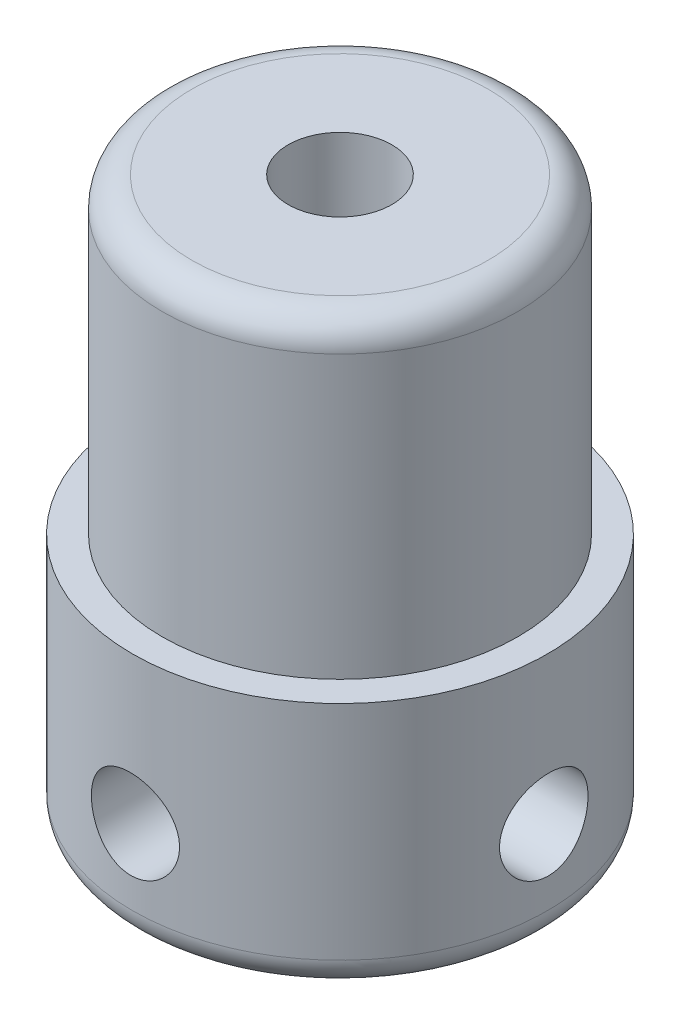
ISO-10303-21;
HEADER;
FILE_DESCRIPTION(('STEP AP214'),'2;1');
FILE_NAME('part.step','',(''),(''),'','','');
FILE_SCHEMA(('AUTOMOTIVE_DESIGN { 1 0 10303 214 1 1 1 1 }'));
ENDSEC;
DATA;
#1=APPLICATION_CONTEXT('core data for automotive mechanical design processes');
#2=APPLICATION_PROTOCOL_DEFINITION('international standard','automotive_design',2000,#1);
#3=PRODUCT_CONTEXT('',#1,'mechanical');
#4=PRODUCT('Part','Part','',(#3));
#5=PRODUCT_RELATED_PRODUCT_CATEGORY('part','',(#4));
#6=PRODUCT_DEFINITION_FORMATION('','',#4);
#7=PRODUCT_DEFINITION_CONTEXT('part definition',#1,'design');
#8=PRODUCT_DEFINITION('design','',#6,#7);
#9=PRODUCT_DEFINITION_SHAPE('','',#8);
#10=(LENGTH_UNIT() NAMED_UNIT(*) SI_UNIT(.MILLI.,.METRE.));
#11=(NAMED_UNIT(*) PLANE_ANGLE_UNIT() SI_UNIT($,.RADIAN.));
#12=(NAMED_UNIT(*) SI_UNIT($,.STERADIAN.) SOLID_ANGLE_UNIT());
#13=UNCERTAINTY_MEASURE_WITH_UNIT(LENGTH_MEASURE(1.E-05),#10,'distance_accuracy_value','');
#14=(GEOMETRIC_REPRESENTATION_CONTEXT(3) GLOBAL_UNCERTAINTY_ASSIGNED_CONTEXT((#13)) GLOBAL_UNIT_ASSIGNED_CONTEXT((#10,
#11,#12)) REPRESENTATION_CONTEXT('',''));
#15=CARTESIAN_POINT('',(0.,0.,0.));
#16=DIRECTION('',(0.,0.,1.));
#17=DIRECTION('',(1.,0.,0.));
#18=AXIS2_PLACEMENT_3D('',#15,#16,#17);
#19=CARTESIAN_POINT('',(-14.3123668381804,8.5,-6.40728050313883));
#20=DIRECTION('',(0.,-1.,0.));
#21=DIRECTION('',(0.,0.,-1.));
#22=AXIS2_PLACEMENT_3D('',#19,#20,#21);
#23=CYLINDRICAL_SURFACE('',#22,7.);
#24=CARTESIAN_POINT('',(-7.48286172927359,3.5,-7.94281297346152));
#25=CARTESIAN_POINT('',(-7.48286003159209,3.41684905906204,-7.94281004962418));
#26=CARTESIAN_POINT('',(-7.48129048481099,3.33366266436916,-7.93587524798542));
#27=CARTESIAN_POINT('',(-7.47519024919394,3.16965431702362,-7.90834935228958));
#28=CARTESIAN_POINT('',(-7.47065736078958,3.08883416733196,-7.88774811402277));
#29=CARTESIAN_POINT('',(-7.45915884845227,2.93195634842496,-7.83356977599854));
#30=CARTESIAN_POINT('',(-7.45219591234133,2.85589352639696,-7.80000700834909));
#31=CARTESIAN_POINT('',(-7.43661090340418,2.71047847104764,-7.72090084952481));
#32=CARTESIAN_POINT('',(-7.42798887334753,2.64112606480872,-7.67535776717768));
#33=CARTESIAN_POINT('',(-7.40987490451002,2.50992443183276,-7.57276416854372));
#34=CARTESIAN_POINT('',(-7.40037173277943,2.44820531410035,-7.51554922204512));
#35=CARTESIAN_POINT('',(-7.38163442696482,2.33515913854833,-7.39159270313348));
#36=CARTESIAN_POINT('',(-7.37240031490182,2.28383292929565,-7.3248503535788));
#37=CARTESIAN_POINT('',(-7.35509010961292,2.19248680904258,-7.18282330086932));
#38=CARTESIAN_POINT('',(-7.34702795833464,2.15259826711838,-7.10745225902204));
#39=CARTESIAN_POINT('',(-7.33306356084919,2.0861029355174,-6.95087524930241));
#40=CARTESIAN_POINT('',(-7.3271610868121,2.0594947447543,-6.86966989798827));
#41=CARTESIAN_POINT('',(-7.31822272010166,2.02070937525398,-6.70500875526633));
#42=CARTESIAN_POINT('',(-7.31514545668786,2.00832323841109,-6.62160447016974));
#43=CARTESIAN_POINT('',(-7.31201928781543,1.9976884263833,-6.45384731545451));
#44=CARTESIAN_POINT('',(-7.31197003448442,1.9994381271792,-6.36949455591484));
#45=CARTESIAN_POINT('',(-7.31484331083287,2.01686839094501,-6.20376107041578));
#46=CARTESIAN_POINT('',(-7.31771503082161,2.03231019343622,-6.12235418807919));
#47=CARTESIAN_POINT('',(-7.32600636328768,2.07631371470547,-5.96330657491148));
#48=CARTESIAN_POINT('',(-7.33142607436597,2.10487594121054,-5.88566598995503));
#49=CARTESIAN_POINT('',(-7.34423872653936,2.17448118073733,-5.73579913118435));
#50=CARTESIAN_POINT('',(-7.35164352430741,2.21559940140564,-5.66360884586189));
#51=CARTESIAN_POINT('',(-7.36758778614937,2.30909391595069,-5.52706671024194));
#52=CARTESIAN_POINT('',(-7.37612739518216,2.36147164862736,-5.46271586335733));
#53=CARTESIAN_POINT('',(-7.39357368980208,2.47721638331,-5.34234929840502));
#54=CARTESIAN_POINT('',(-7.40248429090447,2.54077904248402,-5.28652214267852));
#55=CARTESIAN_POINT('',(-7.4194898780649,2.67644614861681,-5.18628098009047));
#56=CARTESIAN_POINT('',(-7.42758484131497,2.74855083431679,-5.14186729233408));
#57=CARTESIAN_POINT('',(-7.4420376200377,2.89960265133859,-5.06560423909236));
#58=CARTESIAN_POINT('',(-7.44838949159437,2.97857201499112,-5.03379770393891));
#59=CARTESIAN_POINT('',(-7.4585494393086,3.14089794513962,-4.98396024574785));
#60=CARTESIAN_POINT('',(-7.46235788102588,3.224253879308,-4.96592734301286));
#61=CARTESIAN_POINT('',(-7.46691681943493,3.39133153466732,-4.94442922294286));
#62=CARTESIAN_POINT('',(-7.46772269668237,3.47501782762453,-4.9407001414211));
#63=CARTESIAN_POINT('',(-7.46633289809933,3.64181696123966,-4.9472017301054));
#64=CARTESIAN_POINT('',(-7.46413741169368,3.72492983775483,-4.95743151932627));
#65=CARTESIAN_POINT('',(-7.45704984189181,3.8872948008539,-4.99132844904519));
#66=CARTESIAN_POINT('',(-7.452187298217,3.9665790101284,-5.01484847459867));
#67=CARTESIAN_POINT('',(-7.44035002859517,4.12008202888119,-5.07449998491661));
#68=CARTESIAN_POINT('',(-7.43337511226561,4.19430038104811,-5.11063260646571));
#69=CARTESIAN_POINT('',(-7.41799021595317,4.33672678442278,-5.19507915796483));
#70=CARTESIAN_POINT('',(-7.40956124837888,4.40483441822251,-5.24355892199505));
#71=CARTESIAN_POINT('',(-7.39229027051949,4.53204649148286,-5.35110819903295));
#72=CARTESIAN_POINT('',(-7.38344821359666,4.59114991114359,-5.41017890990396));
#73=CARTESIAN_POINT('',(-7.36619259343118,4.69968935905513,-5.53842423130621));
#74=CARTESIAN_POINT('',(-7.35778872005986,4.74894636452474,-5.60775186594175));
#75=CARTESIAN_POINT('',(-7.34254455974642,4.83511402177639,-5.75385573461065));
#76=CARTESIAN_POINT('',(-7.33570419452172,4.87202529173431,-5.83063159544788));
#77=CARTESIAN_POINT('',(-7.32443169686999,4.93217208924676,-5.98893741407097));
#78=CARTESIAN_POINT('',(-7.31998349960851,4.95549893437609,-6.07043148098373));
#79=CARTESIAN_POINT('',(-7.31396425183787,4.98811453332969,-6.23628190490292));
#80=CARTESIAN_POINT('',(-7.31239280926986,4.99740520004605,-6.32063787027889));
#81=CARTESIAN_POINT('',(-7.31234200273586,5.00160867735473,-6.48805674747027));
#82=CARTESIAN_POINT('',(-7.3138029827579,4.99679812923499,-6.57111282511613));
#83=CARTESIAN_POINT('',(-7.31956950808988,4.97356028617784,-6.73519219663035));
#84=CARTESIAN_POINT('',(-7.32387502157804,4.95513314356881,-6.81621551322866));
#85=CARTESIAN_POINT('',(-7.33488294535173,4.90529852748538,-6.97380563350132));
#86=CARTESIAN_POINT('',(-7.34158054023145,4.87391711212042,-7.0503810336229));
#87=CARTESIAN_POINT('',(-7.3566886136601,4.79910379925833,-7.19721378507393));
#88=CARTESIAN_POINT('',(-7.36509925852957,4.75567073151404,-7.26747052196687));
#89=CARTESIAN_POINT('',(-7.38294101262895,4.65702103646583,-7.40110827195386));
#90=CARTESIAN_POINT('',(-7.39238842289432,4.60159694568235,-7.46433398463595));
#91=CARTESIAN_POINT('',(-7.41116324243899,4.48095826440397,-7.58068164395998));
#92=CARTESIAN_POINT('',(-7.42049062234726,4.41574132529426,-7.63380115988981));
#93=CARTESIAN_POINT('',(-7.43811965344027,4.27638568177062,-7.72906262422638));
#94=CARTESIAN_POINT('',(-7.44640706955571,4.20214590008957,-7.77105948269126));
#95=CARTESIAN_POINT('',(-7.46085917388573,4.04749401966416,-7.84190950993976));
#96=CARTESIAN_POINT('',(-7.46702571021739,3.96708736979406,-7.87077412916553));
#97=CARTESIAN_POINT('',(-7.47538097143556,3.82213996516688,-7.90924819398388));
#98=CARTESIAN_POINT('',(-7.47816820272038,3.75840122576726,-7.92181110544392));
#99=CARTESIAN_POINT('',(-7.48190920117304,3.62978215491901,-7.93859444054184));
#100=CARTESIAN_POINT('',(-7.48286305436643,3.56490187717769,-7.94281525560686));
#101=CARTESIAN_POINT('',(-7.48286172927359,3.5,-7.94281297346152));
#102=B_SPLINE_CURVE_WITH_KNOTS('',3,(#24,#25,#26,#27,#28,#29,#30,#31,#32,#33,#34,#35,#36,#37,
#38,#39,#40,#41,#42,#43,#44,#45,#46,#47,#48,#49,#50,#51,#52,#53,#54,#55,#56,#57,#58,#59,#60,#61,
#62,#63,#64,#65,#66,#67,#68,#69,#70,#71,#72,#73,#74,#75,#76,#77,#78,#79,#80,#81,#82,#83,#84,#85,
#86,#87,#88,#89,#90,#91,#92,#93,#94,#95,#96,#97,#98,#99,#100,#101),.UNSPECIFIED.,.T.,.F.,(4,2,2,
2,2,2,2,2,2,2,2,2,2,2,2,2,2,2,2,2,2,2,2,2,2,2,2,2,2,2,2,2,2,2,2,2,2,2,4),(0.,0.249214829508589,
0.498614851437529,0.747739887246154,0.996858501756397,1.24976469103879,1.50269152145051,
1.75841659696447,2.01411468759858,2.26600581435218,2.51786800258644,2.76542278743691,
3.01298715283484,3.2620644697182,3.51117363395701,3.76517618241354,4.0191858316661,
4.27405118073339,4.52887989086288,4.77898448413133,5.02907329329694,5.27644652591259,
5.52384206026024,5.77475383337013,6.0256940031695,6.28084844438866,6.53599010759682,
6.78939623995675,7.04276783425993,7.29120219191898,7.53963377039333,7.78756803393173,
8.03552638096946,8.28817771662881,8.54088974262024,8.79675184564345,9.05239042428626,
9.24691942258559,9.44143929299445),.UNSPECIFIED.);
#103=CARTESIAN_POINT('',(-7.48286172927359,3.5,-7.94281297346152));
#104=VERTEX_POINT('',#103);
#105=EDGE_CURVE('E69',#104,#104,#102,.T.);
#106=ORIENTED_EDGE('',*,*,#105,.T.);
#107=EDGE_LOOP('',(#106));
#108=FACE_BOUND('',#107,.T.);
#109=CARTESIAN_POINT('',(-14.3123668381804,1.,-6.40728050313883));
#110=DIRECTION('',(0.,1.,0.));
#111=DIRECTION('',(0.,0.,1.));
#112=AXIS2_PLACEMENT_3D('',#109,#110,#111);
#113=CIRCLE('',#112,7.);
#114=CARTESIAN_POINT('',(-14.3123668381804,1.,0.59271949686117));
#115=VERTEX_POINT('',#114);
#116=EDGE_CURVE('E121',#115,#115,#113,.T.);
#117=ORIENTED_EDGE('',*,*,#116,.T.);
#118=EDGE_LOOP('',(#117));
#119=FACE_BOUND('',#118,.T.);
#120=CARTESIAN_POINT('',(-14.3123668381804,8.5,-6.40728050313883));
#121=DIRECTION('',(0.,1.,0.));
#122=DIRECTION('',(0.,0.,1.));
#123=AXIS2_PLACEMENT_3D('',#120,#121,#122);
#124=CIRCLE('',#123,7.);
#125=CARTESIAN_POINT('',(-14.3123668381804,8.5,0.59271949686117));
#126=VERTEX_POINT('',#125);
#127=EDGE_CURVE('E129',#126,#126,#124,.T.);
#128=ORIENTED_EDGE('',*,*,#127,.F.);
#129=EDGE_LOOP('',(#128));
#130=FACE_BOUND('',#129,.T.);
#131=CARTESIAN_POINT('',(-15.8741448831732,3.5,0.416270576627369));
#132=CARTESIAN_POINT('',(-15.8741419546933,3.41689461036784,0.416272287457928));
#133=CARTESIAN_POINT('',(-15.8672146521492,3.3337537786189,0.41786815667538));
#134=CARTESIAN_POINT('',(-15.8397196556162,3.1698366221913,0.424072558086127));
#135=CARTESIAN_POINT('',(-15.8191418187978,3.08906210240107,0.428683330422572));
#136=CARTESIAN_POINT('',(-15.7650287915706,2.93227562233308,0.440385775458266));
#137=CARTESIAN_POINT('',(-15.7315082286621,2.85625839779914,0.447474646628029));
#138=CARTESIAN_POINT('',(-15.652506094501,2.71092756664083,0.463355791910882));
#139=CARTESIAN_POINT('',(-15.6070248016306,2.64161380404679,0.472148026377461));
#140=CARTESIAN_POINT('',(-15.5045496177336,2.51044482506762,0.490650059235422));
#141=CARTESIAN_POINT('',(-15.4473863375834,2.44872365164389,0.500372086767839));
#142=CARTESIAN_POINT('',(-15.3235385424729,2.33566194216302,0.519584004363411));
#143=CARTESIAN_POINT('',(-15.2568532092234,2.28432229917246,0.529073874393646));
#144=CARTESIAN_POINT('',(-15.1148868584578,2.19289945753859,0.546936352469309));
#145=CARTESIAN_POINT('',(-15.0395135934619,2.15295641758576,0.555294435647169));
#146=CARTESIAN_POINT('',(-14.8829156436043,2.086355895672,0.569871464833088));
#147=CARTESIAN_POINT('',(-14.8016915670014,2.05969703494388,0.576090632818747));
#148=CARTESIAN_POINT('',(-14.6369621196509,2.02081683864133,0.585668899573833));
#149=CARTESIAN_POINT('',(-14.5535080444142,2.00838842219121,0.589068817061382));
#150=CARTESIAN_POINT('',(-14.3856335282978,1.99768846783686,0.592839291248842));
#151=CARTESIAN_POINT('',(-14.3012132030792,1.99941525287756,0.593210206803124));
#152=CARTESIAN_POINT('',(-14.1353810772393,2.01682066893663,0.590964643436417));
#153=CARTESIAN_POINT('',(-14.0539424746572,2.03225234230622,0.588400812485294));
#154=CARTESIAN_POINT('',(-13.8948241461573,2.07624930220067,0.580709678412844));
#155=CARTESIAN_POINT('',(-13.8171445509976,2.10481504523492,0.575582286187613));
#156=CARTESIAN_POINT('',(-13.6672532141145,2.17441719252,0.563337787146561));
#157=CARTESIAN_POINT('',(-13.5950732365834,2.21552005261242,0.556210093776687));
#158=CARTESIAN_POINT('',(-13.4585468841803,2.30898104962948,0.540792514395009));
#159=CARTESIAN_POINT('',(-13.3942014928541,2.36134059742972,0.532502482744957));
#160=CARTESIAN_POINT('',(-13.2738584708701,2.47702888286286,0.515527524178695));
#161=CARTESIAN_POINT('',(-13.2180468328521,2.54055057582147,0.506838057487379));
#162=CARTESIAN_POINT('',(-13.1178266970977,2.67612446714552,0.490230790604358));
#163=CARTESIAN_POINT('',(-13.0734185423973,2.74817692203549,0.482313013630831));
#164=CARTESIAN_POINT('',(-12.9971357318998,2.89914694245529,0.468160221254095));
#165=CARTESIAN_POINT('',(-12.9653094820574,2.97808962240038,0.461931733284595));
#166=CARTESIAN_POINT('',(-12.9154260063319,3.14035920858014,0.451962161118735));
#167=CARTESIAN_POINT('',(-12.8973668800015,3.22368550799103,0.448220733611619));
#168=CARTESIAN_POINT('',(-12.8757996932901,3.39077039436006,0.443733683272089));
#169=CARTESIAN_POINT('',(-12.8720386355535,3.47449495626616,0.442935980190391));
#170=CARTESIAN_POINT('',(-12.8784896390814,3.64137582911613,0.444289150118363));
#171=CARTESIAN_POINT('',(-12.8887008453319,3.72453217451831,0.446439842704923));
#172=CARTESIAN_POINT('',(-12.9225814697169,3.88701338615407,0.453389096661224));
#173=CARTESIAN_POINT('',(-12.9461076944396,3.96636943003032,0.458159469309802));
#174=CARTESIAN_POINT('',(-13.0057969238963,4.12001452799706,0.46976783018151));
#175=CARTESIAN_POINT('',(-13.0419610456012,4.19430313352007,0.476606001154938));
#176=CARTESIAN_POINT('',(-13.1264782666736,4.33683138825338,0.491670804586773));
#177=CARTESIAN_POINT('',(-13.1749923745695,4.40497364026882,0.499915262073024));
#178=CARTESIAN_POINT('',(-13.2826251615844,4.53224620634775,0.516778469952204));
#179=CARTESIAN_POINT('',(-13.3417449949755,4.59137553819487,0.525397261008197));
#180=CARTESIAN_POINT('',(-13.4700521645053,4.69991190125847,0.542161959263703));
#181=CARTESIAN_POINT('',(-13.5393858304444,4.74914769210869,0.55029805867551));
#182=CARTESIAN_POINT('',(-13.6854948784625,4.83527194174458,0.564979831186529));
#183=CARTESIAN_POINT('',(-13.7622698642653,4.87216105756843,0.571525588911964));
#184=CARTESIAN_POINT('',(-13.9205337685464,4.93225326285654,0.582190614173657));
#185=CARTESIAN_POINT('',(-14.0019849855259,4.9555524844172,0.586326925354967));
#186=CARTESIAN_POINT('',(-14.167734215072,4.98812822194486,0.591715894286511));
#187=CARTESIAN_POINT('',(-14.2520318445572,4.99740661726037,0.592968938520994));
#188=CARTESIAN_POINT('',(-14.4193529227211,5.00160791854546,0.592392419021812));
#189=CARTESIAN_POINT('',(-14.5023698928283,4.99680208075531,0.590621373785867));
#190=CARTESIAN_POINT('',(-14.6663641151027,4.97358958360949,0.584244471651721));
#191=CARTESIAN_POINT('',(-14.747341381984,4.95518302239518,0.579638635209109));
#192=CARTESIAN_POINT('',(-14.9048966466471,4.90538991796385,0.568043545116723));
#193=CARTESIAN_POINT('',(-14.9814801631805,4.87402008256019,0.56105736142192));
#194=CARTESIAN_POINT('',(-15.1283278211675,4.79923039998361,0.545392885183696));
#195=CARTESIAN_POINT('',(-15.1985913279509,4.75580934438383,0.536714422974316));
#196=CARTESIAN_POINT('',(-15.33227585625,4.65715984103485,0.518355313955746));
#197=CARTESIAN_POINT('',(-15.3955378010724,4.60171879021463,0.508658498774958));
#198=CARTESIAN_POINT('',(-15.5119524159589,4.48103261456884,0.489420451892563));
#199=CARTESIAN_POINT('',(-15.565102651603,4.41578513557146,0.479879258161434));
#200=CARTESIAN_POINT('',(-15.6604079373699,4.2763667701239,0.461865924544527));
#201=CARTESIAN_POINT('',(-15.7024201250139,4.20209624664958,0.453408333066953));
#202=CARTESIAN_POINT('',(-15.7732917892235,4.0473710180685,0.43866858243545));
#203=CARTESIAN_POINT('',(-15.8021628218256,3.96692181940582,0.432384513107341));
#204=CARTESIAN_POINT('',(-15.8406172302084,3.82196316303193,0.423878492767652));
#205=CARTESIAN_POINT('',(-15.8531661353313,3.75825980135033,0.421043699154532));
#206=CARTESIAN_POINT('',(-15.8699309029798,3.62971145365552,0.417239118551376));
#207=CARTESIAN_POINT('',(-15.8741471689493,3.56486652306741,0.416269241267166));
#208=CARTESIAN_POINT('',(-15.8741448831732,3.5,0.416270576627369));
#209=B_SPLINE_CURVE_WITH_KNOTS('',3,(#131,#132,#133,#134,#135,#136,#137,#138,#139,#140,#141,
#142,#143,#144,#145,#146,#147,#148,#149,#150,#151,#152,#153,#154,#155,#156,#157,#158,#159,#160,
#161,#162,#163,#164,#165,#166,#167,#168,#169,#170,#171,#172,#173,#174,#175,#176,#177,#178,#179,
#180,#181,#182,#183,#184,#185,#186,#187,#188,#189,#190,#191,#192,#193,#194,#195,#196,#197,#198,
#199,#200,#201,#202,#203,#204,#205,#206,#207,#208),.UNSPECIFIED.,.T.,.F.,(4,2,2,2,2,2,2,2,2,2,2,
2,2,2,2,2,2,2,2,2,2,2,2,2,2,2,2,2,2,2,2,2,2,2,2,2,2,2,4),(0.,0.249078162771932,
0.498341607035697,0.747324161563753,0.996300921612224,1.24918296345369,1.50208675011555,
1.75797853585199,2.01384375700227,2.26593632785721,2.51799903216356,2.76560977834569,
3.01322913154585,3.26218455524421,3.51117120039317,3.76498426110705,4.01880495605319,
4.27359287921839,4.52834562446551,4.77856907825887,5.02877722064778,5.27634433603685,
5.5239333375998,5.77493215931355,6.02595831502752,6.28101269692374,6.53605350373802,
6.78926761186232,7.04244777621084,7.29078403940902,7.53911851065681,7.78713390750601,
8.03517418289956,8.28802353885869,8.54093369212517,8.79694601721935,9.05273277379938,
9.24715598497839,9.44156978247752),.UNSPECIFIED.);
#210=CARTESIAN_POINT('',(-15.8741448831732,3.5,0.416270576627369));
#211=VERTEX_POINT('',#210);
#212=EDGE_CURVE('E70',#211,#211,#209,.T.);
#213=ORIENTED_EDGE('',*,*,#212,.F.);
#214=EDGE_LOOP('',(#213));
#215=FACE_BOUND('',#214,.T.);
#216=ADVANCED_FACE('F39',(#108,#119,#130,#215),#23,.T.);
#217=CARTESIAN_POINT('',(-14.3123668381804,8.5,-6.40728050313883));
#218=DIRECTION('',(0.,-1.,0.));
#219=DIRECTION('',(0.,0.,-1.));
#220=AXIS2_PLACEMENT_3D('',#217,#218,#219);
#221=CYLINDRICAL_SURFACE('',#220,3.);
#222=CARTESIAN_POINT('',(-14.3123668381804,0.,-6.40728050313883));
#223=DIRECTION('',(0.,1.,0.));
#224=DIRECTION('',(0.,0.,1.));
#225=AXIS2_PLACEMENT_3D('',#222,#223,#224);
#226=CIRCLE('',#225,3.);
#227=CARTESIAN_POINT('',(-14.3123668381804,0.,-3.40728050313883));
#228=VERTEX_POINT('',#227);
#229=EDGE_CURVE('E135',#228,#228,#226,.T.);
#230=ORIENTED_EDGE('',*,*,#229,.F.);
#231=EDGE_LOOP('',(#230));
#232=FACE_BOUND('',#231,.T.);
#233=CARTESIAN_POINT('',(-14.3123668381804,8.5,-6.40728050313883));
#234=DIRECTION('',(0.,1.,0.));
#235=DIRECTION('',(0.,0.,1.));
#236=AXIS2_PLACEMENT_3D('',#233,#234,#235);
#237=CIRCLE('',#236,3.);
#238=CARTESIAN_POINT('',(-14.3123668381804,8.5,-3.40728050313883));
#239=VERTEX_POINT('',#238);
#240=EDGE_CURVE('E139',#239,#239,#237,.T.);
#241=ORIENTED_EDGE('',*,*,#240,.T.);
#242=EDGE_LOOP('',(#241));
#243=FACE_BOUND('',#242,.T.);
#244=CARTESIAN_POINT('',(-11.735131879434,3.5,-7.94281297346152));
#245=CARTESIAN_POINT('',(-11.7351249298505,3.42218656153712,-7.94280747075976));
#246=CARTESIAN_POINT('',(-11.7314693721633,3.34427390963767,-7.93671663474396));
#247=CARTESIAN_POINT('',(-11.7173764315081,3.19085510917931,-7.91267297881156));
#248=CARTESIAN_POINT('',(-11.7069246339307,3.11535443425089,-7.89469494515624));
#249=CARTESIAN_POINT('',(-11.6807501709081,2.96928089022514,-7.84787126597792));
#250=CARTESIAN_POINT('',(-11.6650567183754,2.89868327288725,-7.81908574502642));
#251=CARTESIAN_POINT('',(-11.6301863291165,2.76334972733486,-7.75165552697284));
#252=CARTESIAN_POINT('',(-11.6110091931037,2.6986141347791,-7.71301026578646));
#253=CARTESIAN_POINT('',(-11.5692787486304,2.57067878156243,-7.62306351786379));
#254=CARTESIAN_POINT('',(-11.5465769085074,2.50809245184192,-7.57095820242231));
#255=CARTESIAN_POINT('',(-11.5014418413175,2.39206824541199,-7.45725377695091));
#256=CARTESIAN_POINT('',(-11.4790087631431,2.33863523970898,-7.39564964498521));
#257=CARTESIAN_POINT('',(-11.4348944169997,2.23853648820342,-7.25913966785688));
#258=CARTESIAN_POINT('',(-11.4133926232025,2.19266770921951,-7.1835858210109));
#259=CARTESIAN_POINT('',(-11.3754248677228,2.11457576188226,-7.02456131388438));
#260=CARTESIAN_POINT('',(-11.3589558360624,2.08234427016935,-6.94109552075977));
#261=CARTESIAN_POINT('',(-11.3338549111702,2.03481646695639,-6.77475750240427));
#262=CARTESIAN_POINT('',(-11.3247563685187,2.01849543872553,-6.69225020524174));
#263=CARTESIAN_POINT('',(-11.3135204627448,1.9999142938132,-6.52521831260549));
#264=CARTESIAN_POINT('',(-11.3113785745245,1.99764503599918,-6.44069506451157));
#265=CARTESIAN_POINT('',(-11.3140803352003,2.00686704889113,-6.28028245405983));
#266=CARTESIAN_POINT('',(-11.3183058208743,2.017124465462,-6.20430756657046));
#267=CARTESIAN_POINT('',(-11.3321493153652,2.04892333869109,-6.0552796334433));
#268=CARTESIAN_POINT('',(-11.3417676343527,2.07046544438727,-5.98222675612484));
#269=CARTESIAN_POINT('',(-11.3655560747853,2.12423891423816,-5.84023557190962));
#270=CARTESIAN_POINT('',(-11.3797655690292,2.15656282098708,-5.77133920659153));
#271=CARTESIAN_POINT('',(-11.4114191673695,2.23081989730539,-5.63975937770957));
#272=CARTESIAN_POINT('',(-11.4288643873495,2.27275638308211,-5.57707806897023));
#273=CARTESIAN_POINT('',(-11.4671925066959,2.36945708527414,-5.45358432005317));
#274=CARTESIAN_POINT('',(-11.4882439052145,2.42504408856132,-5.39346805921701));
#275=CARTESIAN_POINT('',(-11.5303679252751,2.5452597593639,-5.28301019255007));
#276=CARTESIAN_POINT('',(-11.5514405510698,2.60989501812259,-5.23267577676321));
#277=CARTESIAN_POINT('',(-11.5926569382289,2.75142268648553,-5.14003403072631));
#278=CARTESIAN_POINT('',(-11.6126540552259,2.82883577324855,-5.09845012752562));
#279=CARTESIAN_POINT('',(-11.6473473901516,2.99073750725149,-5.02917059992264));
#280=CARTESIAN_POINT('',(-11.6620485987943,3.07521940002183,-5.00146189027248));
#281=CARTESIAN_POINT('',(-11.6829349405254,3.24240346569144,-4.96279383687738));
#282=CARTESIAN_POINT('',(-11.6896624083369,3.32478700193939,-4.95076143564666));
#283=CARTESIAN_POINT('',(-11.6953580721196,3.49065234621136,-4.94054699621167));
#284=CARTESIAN_POINT('',(-11.6943315867095,3.57413336221973,-4.9423554642413));
#285=CARTESIAN_POINT('',(-11.6852253130118,3.73051485591221,-4.95876685565368));
#286=CARTESIAN_POINT('',(-11.6778944123104,3.80360879128132,-4.97201190764948));
#287=CARTESIAN_POINT('',(-11.6581419811529,3.94640431384346,-5.00887991308927));
#288=CARTESIAN_POINT('',(-11.6457188580958,4.01610483210294,-5.03250611342118));
#289=CARTESIAN_POINT('',(-11.6165790693752,4.15356617856127,-5.09053409612759));
#290=CARTESIAN_POINT('',(-11.5997003101508,4.22111363564471,-5.12535674105306));
#291=CARTESIAN_POINT('',(-11.5637197446879,4.34978960820919,-5.20443998539978));
#292=CARTESIAN_POINT('',(-11.5446168168553,4.41091485531194,-5.24870535600222));
#293=CARTESIAN_POINT('',(-11.5036318849972,4.53265593988151,-5.35161692742167));
#294=CARTESIAN_POINT('',(-11.4816906275028,4.59233758292419,-5.41134962651137));
#295=CARTESIAN_POINT('',(-11.4395550260038,4.7011222938375,-5.54035755431793));
#296=CARTESIAN_POINT('',(-11.4193611963059,4.75022225357957,-5.6096355769875));
#297=CARTESIAN_POINT('',(-11.3824758240973,4.83732693121719,-5.75790197331342));
#298=CARTESIAN_POINT('',(-11.3658703507773,4.87506606888996,-5.83706929570945));
#299=CARTESIAN_POINT('',(-11.3387453009201,4.93634916405911,-6.00168301239004));
#300=CARTESIAN_POINT('',(-11.3282204582002,4.959905405523,-6.08712390088761));
#301=CARTESIAN_POINT('',(-11.3152587617322,4.99017768520993,-6.25345724374041));
#302=CARTESIAN_POINT('',(-11.3121733131625,4.99823059215764,-6.33405652563521));
#303=CARTESIAN_POINT('',(-11.3125790308334,5.00124486947687,-6.49547166045112));
#304=CARTESIAN_POINT('',(-11.3160681091157,4.996210395986,-6.57628743647811));
#305=CARTESIAN_POINT('',(-11.3288974487216,4.97406792107182,-6.73061074702718));
#306=CARTESIAN_POINT('',(-11.337863856047,4.9577231195991,-6.80426173227835));
#307=CARTESIAN_POINT('',(-11.3605357363879,4.91448966685499,-6.94761689736872));
#308=CARTESIAN_POINT('',(-11.3742419427018,4.8875993839967,-7.01732046455641));
#309=CARTESIAN_POINT('',(-11.40600757866,4.82272280388119,-7.15444928716868));
#310=CARTESIAN_POINT('',(-11.4242406371048,4.78427633891426,-7.22161548556386));
#311=CARTESIAN_POINT('',(-11.4631613026746,4.69795745350005,-7.34879988610878));
#312=CARTESIAN_POINT('',(-11.4838500774649,4.65008054178959,-7.40881466044007));
#313=CARTESIAN_POINT('',(-11.5281541809269,4.54060836193493,-7.52643141325862));
#314=CARTESIAN_POINT('',(-11.5518530910654,4.47811291373528,-7.58316651645993));
#315=CARTESIAN_POINT('',(-11.5977863283925,4.34409155938516,-7.68564445496057));
#316=CARTESIAN_POINT('',(-11.6200193147077,4.27255755542519,-7.73137732511438));
#317=CARTESIAN_POINT('',(-11.6609993849488,4.11957943376015,-7.81168369372705));
#318=CARTESIAN_POINT('',(-11.6796216965463,4.03790217709069,-7.84588071619018));
#319=CARTESIAN_POINT('',(-11.7096126702644,3.86871603086476,-7.89947315050489));
#320=CARTESIAN_POINT('',(-11.7210064943165,3.78122855462087,-7.91891995374456));
#321=CARTESIAN_POINT('',(-11.7302148773878,3.66064392750383,-7.93453472165408));
#322=CARTESIAN_POINT('',(-11.7320522618064,3.62862826402064,-7.93763413578762));
#323=CARTESIAN_POINT('',(-11.7345122467795,3.56441407787644,-7.94177447762734));
#324=CARTESIAN_POINT('',(-11.7351347566311,3.5322155417421,-7.94281525163509));
#325=CARTESIAN_POINT('',(-11.735131879434,3.5,-7.94281297346152));
#326=B_SPLINE_CURVE_WITH_KNOTS('',3,(#244,#245,#246,#247,#248,#249,#250,#251,#252,#253,#254,
#255,#256,#257,#258,#259,#260,#261,#262,#263,#264,#265,#266,#267,#268,#269,#270,#271,#272,#273,
#274,#275,#276,#277,#278,#279,#280,#281,#282,#283,#284,#285,#286,#287,#288,#289,#290,#291,#292,
#293,#294,#295,#296,#297,#298,#299,#300,#301,#302,#303,#304,#305,#306,#307,#308,#309,#310,#311,
#312,#313,#314,#315,#316,#317,#318,#319,#320,#321,#322,#323,#324,#325),.UNSPECIFIED.,.T.,.F.,(4,
2,2,2,2,2,2,2,2,2,2,2,2,2,2,2,2,2,2,2,2,2,2,2,2,2,2,2,2,2,2,2,2,2,2,2,2,2,2,2,4),(0.,
0.233303858752706,0.467104168772538,0.699622615573295,0.932154367940575,1.18473087557323,
1.43744137883658,1.70891423211738,1.98022115525052,2.23259796109227,2.48481057037098,
2.71406356024762,2.94332973703882,3.17461668821782,3.40598355061945,3.65852731856199,
3.91125601984821,4.1802208522098,4.44893155253932,4.69806837579227,4.94703432577163,
5.16996250809847,5.39296046484751,5.62557788241872,5.85831311553443,6.11886692261252,
6.37949715744639,6.64581641013036,6.9119046676255,7.15378992672865,7.39559838011752,
7.62250444139093,7.84944562321499,8.08700157952178,8.32467094692414,8.58652376719146,
8.84861287216501,9.11857473912078,9.38759165307012,9.48417457325883,9.58076470407315),.UNSPECIFIED.);
#327=CARTESIAN_POINT('',(-11.735131879434,3.5,-7.94281297346152));
#328=VERTEX_POINT('',#327);
#329=EDGE_CURVE('E62',#328,#328,#326,.T.);
#330=ORIENTED_EDGE('',*,*,#329,.F.);
#331=EDGE_LOOP('',(#330));
#332=FACE_BOUND('',#331,.T.);
#333=CARTESIAN_POINT('',(-15.8741448831732,3.5,-3.84586500810909));
#334=CARTESIAN_POINT('',(-15.8741393458388,3.42245085607724,-3.84585795241444));
#335=CARTESIAN_POINT('',(-15.8680891404015,3.34480208757377,-3.84214220387767));
#336=CARTESIAN_POINT('',(-15.8442128776808,3.19191454962818,-3.82781758555312));
#337=CARTESIAN_POINT('',(-15.8263615657022,3.11668131234489,-3.81719393346146));
#338=CARTESIAN_POINT('',(-15.7798895133642,2.97114693598855,-3.79058744571134));
#339=CARTESIAN_POINT('',(-15.7513301306276,2.90082035433606,-3.77463519885498));
#340=CARTESIAN_POINT('',(-15.6844535439765,2.76599680199012,-3.7391713395007));
#341=CARTESIAN_POINT('',(-15.6461357625993,2.70150017659613,-3.71965951638078));
#342=CARTESIAN_POINT('',(-15.5568528614186,2.57382668590854,-3.67709580701214));
#343=CARTESIAN_POINT('',(-15.5050656483381,2.51127814671605,-3.65388340834986));
#344=CARTESIAN_POINT('',(-15.3920447779851,2.39526304655188,-3.60763303576162));
#345=CARTESIAN_POINT('',(-15.3308058969834,2.34180154232753,-3.58459516572537));
#346=CARTESIAN_POINT('',(-15.1947302869191,2.24129215736065,-3.53900997749314));
#347=CARTESIAN_POINT('',(-15.1191996469845,2.19509176782833,-3.51664718475188));
#348=CARTESIAN_POINT('',(-14.9601187773429,2.11634677152338,-3.47690160446886));
#349=CARTESIAN_POINT('',(-14.8765733336455,2.08379407668958,-3.45951586930668));
#350=CARTESIAN_POINT('',(-14.7098564861531,2.03565746331188,-3.43261518398742));
#351=CARTESIAN_POINT('',(-14.6270528821849,2.01906234310269,-3.4226419674471));
#352=CARTESIAN_POINT('',(-14.4593135612144,2.00004782713878,-3.40970413030942));
#353=CARTESIAN_POINT('',(-14.3743793435686,1.9976187287639,-3.40673471348586));
#354=CARTESIAN_POINT('',(-14.2133632173815,2.00666999663647,-3.40793532468487));
#355=CARTESIAN_POINT('',(-14.1371998628345,2.01686397325841,-3.41146030485119));
#356=CARTESIAN_POINT('',(-13.9877531310977,2.04860859148891,-3.42395199362045));
#357=CARTESIAN_POINT('',(-13.9144698817198,2.07015973648976,-3.43291894343457));
#358=CARTESIAN_POINT('',(-13.7722751951199,2.12393166509844,-3.45541412380757));
#359=CARTESIAN_POINT('',(-13.7033877540905,2.15620588224131,-3.46896520355645));
#360=CARTESIAN_POINT('',(-13.5718008270482,2.23037243312232,-3.49933819288348));
#361=CARTESIAN_POINT('',(-13.5091034257277,2.27226799145958,-3.51616119875986));
#362=CARTESIAN_POINT('',(-13.3856996162161,2.36878482511207,-3.55319569388117));
#363=CARTESIAN_POINT('',(-13.3256709639661,2.42420840347206,-3.57357561922983));
#364=CARTESIAN_POINT('',(-13.2153509974048,2.54405124759512,-3.61442822450603));
#365=CARTESIAN_POINT('',(-13.1650666203783,2.60847686646943,-3.63490095997365));
#366=CARTESIAN_POINT('',(-13.0724581450084,2.74954670343336,-3.67500347234711));
#367=CARTESIAN_POINT('',(-13.0308604954014,2.82671202101132,-3.69449278610104));
#368=CARTESIAN_POINT('',(-12.961485505032,2.98805636217223,-3.72835837088015));
#369=CARTESIAN_POINT('',(-12.9336961046953,3.07222919038354,-3.7427391003983));
#370=CARTESIAN_POINT('',(-12.8946822486635,3.23918205089446,-3.76330061095494));
#371=CARTESIAN_POINT('',(-12.8824565314124,3.32166494153281,-3.7699741248291));
#372=CARTESIAN_POINT('',(-12.8718927354907,3.48775620293408,-3.77572615719882));
#373=CARTESIAN_POINT('',(-12.8735453600797,3.57136378282055,-3.7748097599841));
#374=CARTESIAN_POINT('',(-12.8897386792906,3.72831735419304,-3.76603244025631));
#375=CARTESIAN_POINT('',(-12.9029593198797,3.80184613201325,-3.75888307209984));
#376=CARTESIAN_POINT('',(-12.9399124736487,3.94551349019106,-3.73954734238196));
#377=CARTESIAN_POINT('',(-12.9636481903215,4.01565103015568,-3.72735944587256));
#378=CARTESIAN_POINT('',(-13.021973941099,4.15382614405318,-3.6987795786245));
#379=CARTESIAN_POINT('',(-13.0569682630464,4.22166045721719,-3.68223603071626));
#380=CARTESIAN_POINT('',(-13.1364951242978,4.35087322406844,-3.64698772244039));
#381=CARTESIAN_POINT('',(-13.1810324242853,4.41224843264542,-3.62828188552944));
#382=CARTESIAN_POINT('',(-13.2843854743816,4.53417671260577,-3.58829819815285));
#383=CARTESIAN_POINT('',(-13.3442536319993,4.59382579868181,-3.56697169074302));
#384=CARTESIAN_POINT('',(-13.4735363825652,4.70251274525298,-3.52614241773445));
#385=CARTESIAN_POINT('',(-13.5429534690814,4.75154782541435,-3.50664013074726));
#386=CARTESIAN_POINT('',(-13.6912364637839,4.8383371065764,-3.47127888254672));
#387=CARTESIAN_POINT('',(-13.7702540124033,4.87586469482005,-3.45549437560748));
#388=CARTESIAN_POINT('',(-13.9344706334125,4.93678029983743,-3.43002088751265));
#389=CARTESIAN_POINT('',(-14.0196643483098,4.96018041087798,-3.42032669226658));
#390=CARTESIAN_POINT('',(-14.1854869792997,4.99025402005651,-3.4089180278641));
#391=CARTESIAN_POINT('',(-14.2658331934977,4.99824738575764,-3.40656190671194));
#392=CARTESIAN_POINT('',(-14.42668170935,5.00123409739769,-3.4083819692939));
#393=CARTESIAN_POINT('',(-14.5071839581004,4.99623126908663,-3.41255623050512));
#394=CARTESIAN_POINT('',(-14.6611236599058,4.97422425869197,-3.42667653316974));
#395=CARTESIAN_POINT('',(-14.7346989041379,4.95793927967578,-3.43627063865002));
#396=CARTESIAN_POINT('',(-14.8778847327651,4.91486355143558,-3.46016968138377));
#397=CARTESIAN_POINT('',(-14.9474946691282,4.88807109063096,-3.47447538605634));
#398=CARTESIAN_POINT('',(-15.0846337347581,4.82334405911327,-3.50748311002993));
#399=CARTESIAN_POINT('',(-15.1518874443987,4.78492184814046,-3.52636830985027));
#400=CARTESIAN_POINT('',(-15.2792339514956,4.69863964955048,-3.56657025038181));
#401=CARTESIAN_POINT('',(-15.3393232229436,4.65077504532945,-3.58788817835217));
#402=CARTESIAN_POINT('',(-15.4571887141225,4.5412214372868,-3.63351474124555));
#403=CARTESIAN_POINT('',(-15.5140830316477,4.47861466205059,-3.65790466597847));
#404=CARTESIAN_POINT('',(-15.6168496544777,4.34429858866191,-3.70514585814112));
#405=CARTESIAN_POINT('',(-15.6627117693876,4.27258096757277,-3.72799568907954));
#406=CARTESIAN_POINT('',(-15.7431853733518,4.11922689844877,-3.77006912920506));
#407=CARTESIAN_POINT('',(-15.7774337013724,4.03736381463813,-3.78916895814471));
#408=CARTESIAN_POINT('',(-15.8310666424764,3.86773056044875,-3.81990107490548));
#409=CARTESIAN_POINT('',(-15.8505043550648,3.77998273163425,-3.83156001538555));
#410=CARTESIAN_POINT('',(-15.8659970968764,3.65937674857717,-3.84091210944967));
#411=CARTESIAN_POINT('',(-15.8690475755593,3.62761338398785,-3.84276290745858));
#412=CARTESIAN_POINT('',(-15.8731226918174,3.563905663353,-3.8452408603081));
#413=CARTESIAN_POINT('',(-15.8741471653437,3.53196129286114,-3.84586791606024));
#414=CARTESIAN_POINT('',(-15.8741448831732,3.5,-3.84586500810909));
#415=B_SPLINE_CURVE_WITH_KNOTS('',3,(#333,#334,#335,#336,#337,#338,#339,#340,#341,#342,#343,
#344,#345,#346,#347,#348,#349,#350,#351,#352,#353,#354,#355,#356,#357,#358,#359,#360,#361,#362,
#363,#364,#365,#366,#367,#368,#369,#370,#371,#372,#373,#374,#375,#376,#377,#378,#379,#380,#381,
#382,#383,#384,#385,#386,#387,#388,#389,#390,#391,#392,#393,#394,#395,#396,#397,#398,#399,#400,
#401,#402,#403,#404,#405,#406,#407,#408,#409,#410,#411,#412,#413,#414),.UNSPECIFIED.,.T.,.F.,(4,
2,2,2,2,2,2,2,2,2,2,2,2,2,2,2,2,2,2,2,2,2,2,2,2,2,2,2,2,2,2,2,2,2,2,2,2,2,2,2,4),(0.,
0.232511366772107,0.465521932091128,0.697217251546247,0.928926284984184,1.18125723562826,
1.43372814675997,1.70626572238836,1.97864155442275,2.23232509933177,2.48583487037196,
2.71550787363679,2.94519105772643,3.1760363717136,3.40695916686968,3.65850302541067,
3.91022531400032,4.17825010451831,4.44604039961989,4.69555088603717,4.94489424520795,
5.16902562785503,5.39322534073769,5.62659611999628,5.86008359258439,6.1203869727772,
6.38075845701918,6.64596935843831,6.91095289467202,7.15200288413095,7.39298192262579,
7.61986363103217,7.84678231192534,8.08498038176081,8.32329520206017,8.58625637606592,
8.8494595213407,9.12026381174203,9.39009257698512,9.4859126190213,9.58174041944613),.UNSPECIFIED.);
#416=CARTESIAN_POINT('',(-15.8741448831732,3.5,-3.84586500810909));
#417=VERTEX_POINT('',#416);
#418=EDGE_CURVE('E43',#417,#417,#415,.T.);
#419=ORIENTED_EDGE('',*,*,#418,.T.);
#420=EDGE_LOOP('',(#419));
#421=FACE_BOUND('',#420,.T.);
#422=ADVANCED_FACE('F71',(#232,#243,#332,#421),#221,.F.);
#423=CARTESIAN_POINT('',(-14.3123668381804,8.5,-6.40728050313883));
#424=DIRECTION('',(0.,1.,0.));
#425=DIRECTION('',(0.,0.,1.));
#426=AXIS2_PLACEMENT_3D('',#423,#424,#425);
#427=PLANE('',#426);
#428=CARTESIAN_POINT('',(-14.3123668381804,8.5,-6.40728050313883));
#429=DIRECTION('',(0.,1.,0.));
#430=DIRECTION('',(0.,0.,1.));
#431=AXIS2_PLACEMENT_3D('',#428,#429,#430);
#432=CIRCLE('',#431,6.);
#433=CARTESIAN_POINT('',(-14.3123668381804,8.5,-12.4072805031388));
#434=VERTEX_POINT('',#433);
#435=EDGE_CURVE('E124',#434,#434,#432,.T.);
#436=ORIENTED_EDGE('',*,*,#435,.F.);
#437=EDGE_LOOP('',(#436));
#438=FACE_BOUND('',#437,.T.);
#439=ORIENTED_EDGE('',*,*,#127,.T.);
#440=EDGE_LOOP('',(#439));
#441=FACE_BOUND('',#440,.T.);
#442=ADVANCED_FACE('F161',(#438,#441),#427,.T.);
#443=CARTESIAN_POINT('',(-14.3123668381804,0.,-6.40728050313883));
#444=DIRECTION('',(0.,1.,0.));
#445=DIRECTION('',(0.,0.,1.));
#446=AXIS2_PLACEMENT_3D('',#443,#444,#445);
#447=PLANE('',#446);
#448=CARTESIAN_POINT('',(-14.3123668381804,0.,-6.40728050313883));
#449=DIRECTION('',(0.,1.,0.));
#450=DIRECTION('',(0.,0.,1.));
#451=AXIS2_PLACEMENT_3D('',#448,#449,#450);
#452=CIRCLE('',#451,6.);
#453=CARTESIAN_POINT('',(-14.3123668381804,0.,-0.40728050313883));
#454=VERTEX_POINT('',#453);
#455=EDGE_CURVE('E59',#454,#454,#452,.F.);
#456=ORIENTED_EDGE('',*,*,#455,.T.);
#457=EDGE_LOOP('',(#456));
#458=FACE_BOUND('',#457,.T.);
#459=ORIENTED_EDGE('',*,*,#229,.T.);
#460=EDGE_LOOP('',(#459));
#461=FACE_BOUND('',#460,.T.);
#462=ADVANCED_FACE('F104',(#458,#461),#447,.F.);
#463=CARTESIAN_POINT('',(-14.3123668381804,19.,-6.40728050313883));
#464=DIRECTION('',(0.,1.,0.));
#465=DIRECTION('',(0.,0.,1.));
#466=AXIS2_PLACEMENT_3D('',#463,#464,#465);
#467=PLANE('',#466);
#468=CARTESIAN_POINT('',(-14.3123668381804,19.,-6.40728050313883));
#469=DIRECTION('',(0.,1.,0.));
#470=DIRECTION('',(0.,0.,1.));
#471=AXIS2_PLACEMENT_3D('',#468,#469,#470);
#472=CIRCLE('',#471,5.);
#473=CARTESIAN_POINT('',(-14.3123668381804,19.,-1.40728050313883));
#474=VERTEX_POINT('',#473);
#475=EDGE_CURVE('E53',#474,#474,#472,.T.);
#476=ORIENTED_EDGE('',*,*,#475,.T.);
#477=EDGE_LOOP('',(#476));
#478=FACE_BOUND('',#477,.T.);
#479=CARTESIAN_POINT('',(-14.3123668381804,19.,-6.40728050313883));
#480=DIRECTION('',(0.,1.,0.));
#481=DIRECTION('',(0.,0.,1.));
#482=AXIS2_PLACEMENT_3D('',#479,#480,#481);
#483=CIRCLE('',#482,1.75);
#484=CARTESIAN_POINT('',(-14.3123668381804,19.,-8.15728050313883));
#485=VERTEX_POINT('',#484);
#486=EDGE_CURVE('E98',#485,#485,#483,.T.);
#487=ORIENTED_EDGE('',*,*,#486,.F.);
#488=EDGE_LOOP('',(#487));
#489=FACE_BOUND('',#488,.T.);
#490=ADVANCED_FACE('F151',(#478,#489),#467,.T.);
#491=CARTESIAN_POINT('',(-14.3123668381804,8.5,-6.40728050313883));
#492=DIRECTION('',(0.,1.,0.));
#493=DIRECTION('',(0.,0.,1.));
#494=AXIS2_PLACEMENT_3D('',#491,#492,#493);
#495=PLANE('',#494);
#496=ORIENTED_EDGE('',*,*,#240,.F.);
#497=EDGE_LOOP('',(#496));
#498=FACE_BOUND('',#497,.T.);
#499=CARTESIAN_POINT('',(-14.3123668381804,8.5,-6.40728050313883));
#500=DIRECTION('',(0.,1.,0.));
#501=DIRECTION('',(0.,0.,1.));
#502=AXIS2_PLACEMENT_3D('',#499,#500,#501);
#503=CIRCLE('',#502,1.75);
#504=CARTESIAN_POINT('',(-14.3123668381804,8.5,-8.15728050313883));
#505=VERTEX_POINT('',#504);
#506=EDGE_CURVE('E94',#505,#505,#503,.T.);
#507=ORIENTED_EDGE('',*,*,#506,.T.);
#508=EDGE_LOOP('',(#507));
#509=FACE_BOUND('',#508,.T.);
#510=ADVANCED_FACE('F153',(#498,#509),#495,.F.);
#511=CARTESIAN_POINT('',(-14.3123668381804,19.,-6.40728050313883));
#512=DIRECTION('',(0.,-1.,0.));
#513=DIRECTION('',(0.,0.,-1.));
#514=AXIS2_PLACEMENT_3D('',#511,#512,#513);
#515=CYLINDRICAL_SURFACE('',#514,6.);
#516=CARTESIAN_POINT('',(-14.3123668381804,18.,-6.40728050313883));
#517=DIRECTION('',(0.,1.,0.));
#518=DIRECTION('',(0.,0.,1.));
#519=AXIS2_PLACEMENT_3D('',#516,#517,#518);
#520=CIRCLE('',#519,6.);
#521=CARTESIAN_POINT('',(-14.3123668381804,18.,-12.4072805031388));
#522=VERTEX_POINT('',#521);
#523=EDGE_CURVE('E10',#522,#522,#520,.F.);
#524=CARTESIAN_POINT('',(-14.3123668381804,18.,-12.4072805031388));
#525=CARTESIAN_POINT('',(-14.3123668381804,17.9010416666667,-12.4072805031388));
#526=CARTESIAN_POINT('',(-14.3123668381804,17.8020833333333,-12.4072805031388));
#527=CARTESIAN_POINT('',(-14.3123668381804,17.6041666666667,-12.4072805031388));
#528=CARTESIAN_POINT('',(-14.3123668381804,17.5052083333333,-12.4072805031388));
#529=CARTESIAN_POINT('',(-14.3123668381804,17.3072916666667,-12.4072805031388));
#530=CARTESIAN_POINT('',(-14.3123668381804,17.2083333333333,-12.4072805031388));
#531=CARTESIAN_POINT('',(-14.3123668381804,17.0104166666667,-12.4072805031388));
#532=CARTESIAN_POINT('',(-14.3123668381804,16.9114583333333,-12.4072805031388));
#533=CARTESIAN_POINT('',(-14.3123668381804,16.7135416666667,-12.4072805031388));
#534=CARTESIAN_POINT('',(-14.3123668381804,16.6145833333333,-12.4072805031388));
#535=CARTESIAN_POINT('',(-14.3123668381804,16.4166666666667,-12.4072805031388));
#536=CARTESIAN_POINT('',(-14.3123668381804,16.3177083333333,-12.4072805031388));
#537=CARTESIAN_POINT('',(-14.3123668381804,16.1197916666667,-12.4072805031388));
#538=CARTESIAN_POINT('',(-14.3123668381804,16.0208333333333,-12.4072805031388));
#539=CARTESIAN_POINT('',(-14.3123668381804,15.8229166666667,-12.4072805031388));
#540=CARTESIAN_POINT('',(-14.3123668381804,15.7239583333333,-12.4072805031388));
#541=CARTESIAN_POINT('',(-14.3123668381804,15.5260416666667,-12.4072805031388));
#542=CARTESIAN_POINT('',(-14.3123668381804,15.4270833333333,-12.4072805031388));
#543=CARTESIAN_POINT('',(-14.3123668381804,15.2291666666667,-12.4072805031388));
#544=CARTESIAN_POINT('',(-14.3123668381804,15.1302083333333,-12.4072805031388));
#545=CARTESIAN_POINT('',(-14.3123668381804,14.9322916666667,-12.4072805031388));
#546=CARTESIAN_POINT('',(-14.3123668381804,14.8333333333333,-12.4072805031388));
#547=CARTESIAN_POINT('',(-14.3123668381804,14.6354166666667,-12.4072805031388));
#548=CARTESIAN_POINT('',(-14.3123668381804,14.5364583333333,-12.4072805031388));
#549=CARTESIAN_POINT('',(-14.3123668381804,14.3385416666667,-12.4072805031388));
#550=CARTESIAN_POINT('',(-14.3123668381804,14.2395833333333,-12.4072805031388));
#551=CARTESIAN_POINT('',(-14.3123668381804,14.0416666666667,-12.4072805031388));
#552=CARTESIAN_POINT('',(-14.3123668381804,13.9427083333333,-12.4072805031388));
#553=CARTESIAN_POINT('',(-14.3123668381804,13.7447916666667,-12.4072805031388));
#554=CARTESIAN_POINT('',(-14.3123668381804,13.6458333333333,-12.4072805031388));
#555=CARTESIAN_POINT('',(-14.3123668381804,13.4479166666667,-12.4072805031388));
#556=CARTESIAN_POINT('',(-14.3123668381804,13.3489583333333,-12.4072805031388));
#557=CARTESIAN_POINT('',(-14.3123668381804,13.1510416666667,-12.4072805031388));
#558=CARTESIAN_POINT('',(-14.3123668381804,13.0520833333333,-12.4072805031388));
#559=CARTESIAN_POINT('',(-14.3123668381804,12.8541666666667,-12.4072805031388));
#560=CARTESIAN_POINT('',(-14.3123668381804,12.7552083333333,-12.4072805031388));
#561=CARTESIAN_POINT('',(-14.3123668381804,12.5572916666667,-12.4072805031388));
#562=CARTESIAN_POINT('',(-14.3123668381804,12.4583333333333,-12.4072805031388));
#563=CARTESIAN_POINT('',(-14.3123668381804,12.2604166666667,-12.4072805031388));
#564=CARTESIAN_POINT('',(-14.3123668381804,12.1614583333333,-12.4072805031388));
#565=CARTESIAN_POINT('',(-14.3123668381804,11.9635416666667,-12.4072805031388));
#566=CARTESIAN_POINT('',(-14.3123668381804,11.8645833333333,-12.4072805031388));
#567=CARTESIAN_POINT('',(-14.3123668381804,11.6666666666667,-12.4072805031388));
#568=CARTESIAN_POINT('',(-14.3123668381804,11.5677083333333,-12.4072805031388));
#569=CARTESIAN_POINT('',(-14.3123668381804,11.3697916666667,-12.4072805031388));
#570=CARTESIAN_POINT('',(-14.3123668381804,11.2708333333333,-12.4072805031388));
#571=CARTESIAN_POINT('',(-14.3123668381804,11.0729166666667,-12.4072805031388));
#572=CARTESIAN_POINT('',(-14.3123668381804,10.9739583333333,-12.4072805031388));
#573=CARTESIAN_POINT('',(-14.3123668381804,10.7760416666667,-12.4072805031388));
#574=CARTESIAN_POINT('',(-14.3123668381804,10.6770833333333,-12.4072805031388));
#575=CARTESIAN_POINT('',(-14.3123668381804,10.4791666666667,-12.4072805031388));
#576=CARTESIAN_POINT('',(-14.3123668381804,10.3802083333333,-12.4072805031388));
#577=CARTESIAN_POINT('',(-14.3123668381804,10.1822916666667,-12.4072805031388));
#578=CARTESIAN_POINT('',(-14.3123668381804,10.0833333333333,-12.4072805031388));
#579=CARTESIAN_POINT('',(-14.3123668381804,9.88541666666667,-12.4072805031388));
#580=CARTESIAN_POINT('',(-14.3123668381804,9.78645833333333,-12.4072805031388));
#581=CARTESIAN_POINT('',(-14.3123668381804,9.58854166666667,-12.4072805031388));
#582=CARTESIAN_POINT('',(-14.3123668381804,9.48958333333333,-12.4072805031388));
#583=CARTESIAN_POINT('',(-14.3123668381804,9.29166666666667,-12.4072805031388));
#584=CARTESIAN_POINT('',(-14.3123668381804,9.19270833333333,-12.4072805031388));
#585=CARTESIAN_POINT('',(-14.3123668381804,8.99479166666667,-12.4072805031388));
#586=CARTESIAN_POINT('',(-14.3123668381804,8.89583333333333,-12.4072805031388));
#587=CARTESIAN_POINT('',(-14.3123668381804,8.69791666666667,-12.4072805031388));
#588=CARTESIAN_POINT('',(-14.3123668381804,8.59895833333333,-12.4072805031388));
#589=CARTESIAN_POINT('',(-14.3123668381804,8.5,-12.4072805031388));
#590=B_SPLINE_CURVE_WITH_KNOTS('',3,(#524,#525,#526,#527,#528,#529,#530,#531,#532,#533,#534,
#535,#536,#537,#538,#539,#540,#541,#542,#543,#544,#545,#546,#547,#548,#549,#550,#551,#552,#553,
#554,#555,#556,#557,#558,#559,#560,#561,#562,#563,#564,#565,#566,#567,#568,#569,#570,#571,#572,
#573,#574,#575,#576,#577,#578,#579,#580,#581,#582,#583,#584,#585,#586,#587,#588,#589),
.UNSPECIFIED.,.F.,.F.,(4,2,2,2,2,2,2,2,2,2,2,2,2,2,2,2,2,2,2,2,2,2,2,2,2,2,2,2,2,2,2,2,4),(0.,
0.296874999999999,0.593749999999997,0.890624999999999,1.1875,1.484375,1.78125,2.078125,2.375,
2.671875,2.96875,3.265625,3.5625,3.859375,4.15625,4.453125,4.75,5.046875,5.34375,5.640625,
5.9375,6.234375,6.53125,6.828125,7.125,7.421875,7.71875,8.015625,8.3125,8.609375,8.90625,
9.203125,9.5),.UNSPECIFIED.);
#591=EDGE_CURVE('BSEAM114',#522,#434,#590,.T.);
#592=ORIENTED_EDGE('',*,*,#523,.T.);
#593=ORIENTED_EDGE('',*,*,#435,.T.);
#594=ORIENTED_EDGE('',*,*,#591,.T.);
#595=ORIENTED_EDGE('',*,*,#591,.F.);
#596=EDGE_LOOP('',(#592,#594,#593,#595));
#597=FACE_BOUND('',#596,.T.);
#598=ADVANCED_FACE('F114',(#597),#515,.T.);
#599=CARTESIAN_POINT('',(-14.3123668381804,19.,-6.40728050313883));
#600=DIRECTION('',(0.,-1.,0.));
#601=DIRECTION('',(0.,0.,-1.));
#602=AXIS2_PLACEMENT_3D('',#599,#600,#601);
#603=CYLINDRICAL_SURFACE('',#602,1.75);
#604=CARTESIAN_POINT('',(-14.3123668381804,19.,-8.15728050313883));
#605=CARTESIAN_POINT('',(-14.3123668381804,18.890625,-8.15728050313883));
#606=CARTESIAN_POINT('',(-14.3123668381804,18.78125,-8.15728050313883));
#607=CARTESIAN_POINT('',(-14.3123668381804,18.5625,-8.15728050313883));
#608=CARTESIAN_POINT('',(-14.3123668381804,18.453125,-8.15728050313883));
#609=CARTESIAN_POINT('',(-14.3123668381804,18.234375,-8.15728050313883));
#610=CARTESIAN_POINT('',(-14.3123668381804,18.125,-8.15728050313883));
#611=CARTESIAN_POINT('',(-14.3123668381804,17.90625,-8.15728050313883));
#612=CARTESIAN_POINT('',(-14.3123668381804,17.796875,-8.15728050313883));
#613=CARTESIAN_POINT('',(-14.3123668381804,17.578125,-8.15728050313883));
#614=CARTESIAN_POINT('',(-14.3123668381804,17.46875,-8.15728050313883));
#615=CARTESIAN_POINT('',(-14.3123668381804,17.25,-8.15728050313883));
#616=CARTESIAN_POINT('',(-14.3123668381804,17.140625,-8.15728050313883));
#617=CARTESIAN_POINT('',(-14.3123668381804,16.921875,-8.15728050313883));
#618=CARTESIAN_POINT('',(-14.3123668381804,16.8125,-8.15728050313883));
#619=CARTESIAN_POINT('',(-14.3123668381804,16.59375,-8.15728050313883));
#620=CARTESIAN_POINT('',(-14.3123668381804,16.484375,-8.15728050313883));
#621=CARTESIAN_POINT('',(-14.3123668381804,16.265625,-8.15728050313883));
#622=CARTESIAN_POINT('',(-14.3123668381804,16.15625,-8.15728050313883));
#623=CARTESIAN_POINT('',(-14.3123668381804,15.9375,-8.15728050313883));
#624=CARTESIAN_POINT('',(-14.3123668381804,15.828125,-8.15728050313883));
#625=CARTESIAN_POINT('',(-14.3123668381804,15.609375,-8.15728050313883));
#626=CARTESIAN_POINT('',(-14.3123668381804,15.5,-8.15728050313883));
#627=CARTESIAN_POINT('',(-14.3123668381804,15.28125,-8.15728050313883));
#628=CARTESIAN_POINT('',(-14.3123668381804,15.171875,-8.15728050313883));
#629=CARTESIAN_POINT('',(-14.3123668381804,14.953125,-8.15728050313883));
#630=CARTESIAN_POINT('',(-14.3123668381804,14.84375,-8.15728050313883));
#631=CARTESIAN_POINT('',(-14.3123668381804,14.625,-8.15728050313883));
#632=CARTESIAN_POINT('',(-14.3123668381804,14.515625,-8.15728050313883));
#633=CARTESIAN_POINT('',(-14.3123668381804,14.296875,-8.15728050313883));
#634=CARTESIAN_POINT('',(-14.3123668381804,14.1875,-8.15728050313883));
#635=CARTESIAN_POINT('',(-14.3123668381804,13.96875,-8.15728050313883));
#636=CARTESIAN_POINT('',(-14.3123668381804,13.859375,-8.15728050313883));
#637=CARTESIAN_POINT('',(-14.3123668381804,13.640625,-8.15728050313883));
#638=CARTESIAN_POINT('',(-14.3123668381804,13.53125,-8.15728050313883));
#639=CARTESIAN_POINT('',(-14.3123668381804,13.3125,-8.15728050313883));
#640=CARTESIAN_POINT('',(-14.3123668381804,13.203125,-8.15728050313883));
#641=CARTESIAN_POINT('',(-14.3123668381804,12.984375,-8.15728050313883));
#642=CARTESIAN_POINT('',(-14.3123668381804,12.875,-8.15728050313883));
#643=CARTESIAN_POINT('',(-14.3123668381804,12.65625,-8.15728050313883));
#644=CARTESIAN_POINT('',(-14.3123668381804,12.546875,-8.15728050313883));
#645=CARTESIAN_POINT('',(-14.3123668381804,12.328125,-8.15728050313883));
#646=CARTESIAN_POINT('',(-14.3123668381804,12.21875,-8.15728050313883));
#647=CARTESIAN_POINT('',(-14.3123668381804,12.,-8.15728050313883));
#648=CARTESIAN_POINT('',(-14.3123668381804,11.890625,-8.15728050313883));
#649=CARTESIAN_POINT('',(-14.3123668381804,11.671875,-8.15728050313883));
#650=CARTESIAN_POINT('',(-14.3123668381804,11.5625,-8.15728050313883));
#651=CARTESIAN_POINT('',(-14.3123668381804,11.34375,-8.15728050313883));
#652=CARTESIAN_POINT('',(-14.3123668381804,11.234375,-8.15728050313883));
#653=CARTESIAN_POINT('',(-14.3123668381804,11.015625,-8.15728050313883));
#654=CARTESIAN_POINT('',(-14.3123668381804,10.90625,-8.15728050313883));
#655=CARTESIAN_POINT('',(-14.3123668381804,10.6875,-8.15728050313883));
#656=CARTESIAN_POINT('',(-14.3123668381804,10.578125,-8.15728050313883));
#657=CARTESIAN_POINT('',(-14.3123668381804,10.359375,-8.15728050313883));
#658=CARTESIAN_POINT('',(-14.3123668381804,10.25,-8.15728050313883));
#659=CARTESIAN_POINT('',(-14.3123668381804,10.03125,-8.15728050313883));
#660=CARTESIAN_POINT('',(-14.3123668381804,9.921875,-8.15728050313883));
#661=CARTESIAN_POINT('',(-14.3123668381804,9.703125,-8.15728050313883));
#662=CARTESIAN_POINT('',(-14.3123668381804,9.59375,-8.15728050313883));
#663=CARTESIAN_POINT('',(-14.3123668381804,9.375,-8.15728050313883));
#664=CARTESIAN_POINT('',(-14.3123668381804,9.265625,-8.15728050313883));
#665=CARTESIAN_POINT('',(-14.3123668381804,9.046875,-8.15728050313883));
#666=CARTESIAN_POINT('',(-14.3123668381804,8.9375,-8.15728050313883));
#667=CARTESIAN_POINT('',(-14.3123668381804,8.71875,-8.15728050313883));
#668=CARTESIAN_POINT('',(-14.3123668381804,8.609375,-8.15728050313883));
#669=CARTESIAN_POINT('',(-14.3123668381804,8.5,-8.15728050313883));
#670=B_SPLINE_CURVE_WITH_KNOTS('',3,(#604,#605,#606,#607,#608,#609,#610,#611,#612,#613,#614,
#615,#616,#617,#618,#619,#620,#621,#622,#623,#624,#625,#626,#627,#628,#629,#630,#631,#632,#633,
#634,#635,#636,#637,#638,#639,#640,#641,#642,#643,#644,#645,#646,#647,#648,#649,#650,#651,#652,
#653,#654,#655,#656,#657,#658,#659,#660,#661,#662,#663,#664,#665,#666,#667,#668,#669),
.UNSPECIFIED.,.F.,.F.,(4,2,2,2,2,2,2,2,2,2,2,2,2,2,2,2,2,2,2,2,2,2,2,2,2,2,2,2,2,2,2,2,4),(0.,
0.328124999999999,0.656249999999997,0.984374999999999,1.3125,1.640625,1.96875,2.296875,2.625,
2.953125,3.28125,3.609375,3.9375,4.265625,4.59375,4.921875,5.25,5.578125,5.90625,6.234375,
6.5625,6.890625,7.21875,7.546875,7.875,8.203125,8.53125,8.859375,9.1875,9.515625,9.84375,
10.171875,10.5),.UNSPECIFIED.);
#671=EDGE_CURVE('BSEAM82',#485,#505,#670,.T.);
#672=ORIENTED_EDGE('',*,*,#486,.T.);
#673=ORIENTED_EDGE('',*,*,#506,.F.);
#674=ORIENTED_EDGE('',*,*,#671,.T.);
#675=ORIENTED_EDGE('',*,*,#671,.F.);
#676=EDGE_LOOP('',(#672,#674,#673,#675));
#677=FACE_BOUND('',#676,.T.);
#678=ADVANCED_FACE('F82',(#677),#603,.F.);
#679=CARTESIAN_POINT('',(-14.3123668381804,1.,-6.40728050313883));
#680=DIRECTION('',(0.,1.,0.));
#681=DIRECTION('',(0.,0.,1.));
#682=AXIS2_PLACEMENT_3D('',#679,#680,#681);
#683=TOROIDAL_SURFACE('',#682,6.,1.);
#684=ORIENTED_EDGE('',*,*,#455,.F.);
#685=EDGE_LOOP('',(#684));
#686=FACE_BOUND('',#685,.T.);
#687=ORIENTED_EDGE('',*,*,#116,.F.);
#688=EDGE_LOOP('',(#687));
#689=FACE_BOUND('',#688,.T.);
#690=ADVANCED_FACE('F105',(#686,#689),#683,.T.);
#691=CARTESIAN_POINT('',(-14.3123668381804,18.,-6.40728050313883));
#692=DIRECTION('',(0.,1.,0.));
#693=DIRECTION('',(0.,0.,1.));
#694=AXIS2_PLACEMENT_3D('',#691,#692,#693);
#695=TOROIDAL_SURFACE('',#694,5.,1.);
#696=ORIENTED_EDGE('',*,*,#523,.F.);
#697=EDGE_LOOP('',(#696));
#698=FACE_BOUND('',#697,.T.);
#699=ORIENTED_EDGE('',*,*,#475,.F.);
#700=EDGE_LOOP('',(#699));
#701=FACE_BOUND('',#700,.T.);
#702=ADVANCED_FACE('F41',(#698,#701),#695,.T.);
#703=CARTESIAN_POINT('',(-14.5,3.5,-6.44281297346152));
#704=DIRECTION('',(1.,0.,0.));
#705=DIRECTION('',(0.,0.,-1.));
#706=AXIS2_PLACEMENT_3D('',#703,#704,#705);
#707=CYLINDRICAL_SURFACE('',#706,1.5);
#708=ORIENTED_EDGE('',*,*,#329,.T.);
#709=EDGE_LOOP('',(#708));
#710=FACE_BOUND('',#709,.T.);
#711=ORIENTED_EDGE('',*,*,#105,.F.);
#712=EDGE_LOOP('',(#711));
#713=FACE_BOUND('',#712,.T.);
#714=ADVANCED_FACE('F75',(#710,#713),#707,.F.);
#715=CARTESIAN_POINT('',(-14.3741448831732,3.5,6.5));
#716=DIRECTION('',(0.,0.,-1.));
#717=DIRECTION('',(-1.,0.,0.));
#718=AXIS2_PLACEMENT_3D('',#715,#716,#717);
#719=CYLINDRICAL_SURFACE('',#718,1.5);
#720=ORIENTED_EDGE('',*,*,#418,.F.);
#721=EDGE_LOOP('',(#720));
#722=FACE_BOUND('',#721,.T.);
#723=ORIENTED_EDGE('',*,*,#212,.T.);
#724=EDGE_LOOP('',(#723));
#725=FACE_BOUND('',#724,.T.);
#726=ADVANCED_FACE('F79',(#722,#725),#719,.F.);
#727=CLOSED_SHELL('',(#216,#422,#442,#462,#490,#510,#598,#678,#690,#702,#714,#726));
#728=MANIFOLD_SOLID_BREP('B2',#727);
#729=ADVANCED_BREP_SHAPE_REPRESENTATION('',(#18,#728),#14);
#730=SHAPE_DEFINITION_REPRESENTATION(#9,#729);
ENDSEC;
END-ISO-10303-21;
